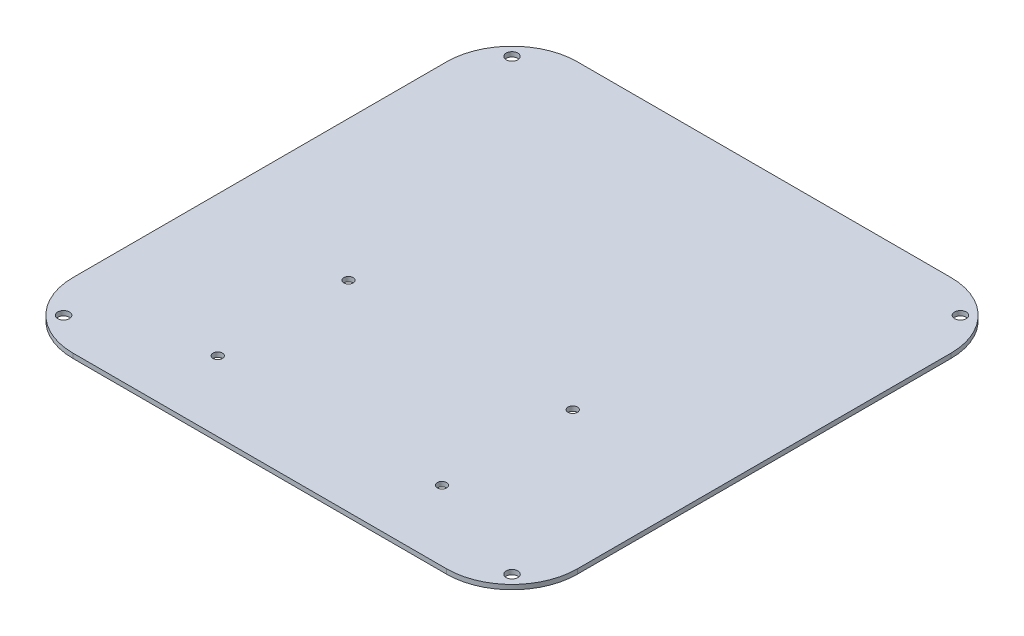
ISO-10303-21;
HEADER;
FILE_DESCRIPTION(('STEP AP214'),'2;1');
FILE_NAME('part.step','',(''),(''),'','','');
FILE_SCHEMA(('AUTOMOTIVE_DESIGN { 1 0 10303 214 1 1 1 1 }'));
ENDSEC;
DATA;
#1=APPLICATION_CONTEXT('core data for automotive mechanical design processes');
#2=APPLICATION_PROTOCOL_DEFINITION('international standard','automotive_design',2000,#1);
#3=PRODUCT_CONTEXT('',#1,'mechanical');
#4=PRODUCT('Part','Part','',(#3));
#5=PRODUCT_RELATED_PRODUCT_CATEGORY('part','',(#4));
#6=PRODUCT_DEFINITION_FORMATION('','',#4);
#7=PRODUCT_DEFINITION_CONTEXT('part definition',#1,'design');
#8=PRODUCT_DEFINITION('design','',#6,#7);
#9=PRODUCT_DEFINITION_SHAPE('','',#8);
#10=(LENGTH_UNIT() NAMED_UNIT(*) SI_UNIT(.MILLI.,.METRE.));
#11=(NAMED_UNIT(*) PLANE_ANGLE_UNIT() SI_UNIT($,.RADIAN.));
#12=(NAMED_UNIT(*) SI_UNIT($,.STERADIAN.) SOLID_ANGLE_UNIT());
#13=UNCERTAINTY_MEASURE_WITH_UNIT(LENGTH_MEASURE(1.E-05),#10,'distance_accuracy_value','');
#14=(GEOMETRIC_REPRESENTATION_CONTEXT(3) GLOBAL_UNCERTAINTY_ASSIGNED_CONTEXT((#13)) GLOBAL_UNIT_ASSIGNED_CONTEXT((#10,
#11,#12)) REPRESENTATION_CONTEXT('',''));
#15=CARTESIAN_POINT('',(0.,0.,0.));
#16=DIRECTION('',(0.,0.,1.));
#17=DIRECTION('',(1.,0.,0.));
#18=AXIS2_PLACEMENT_3D('',#15,#16,#17);
#19=CARTESIAN_POINT('',(-80.,2.,-80.));
#20=DIRECTION('',(0.,-1.,0.));
#21=DIRECTION('',(0.,0.,-1.));
#22=AXIS2_PLACEMENT_3D('',#19,#20,#21);
#23=CYLINDRICAL_SURFACE('',#22,28.);
#24=CARTESIAN_POINT('',(-80.,0.,-80.));
#25=DIRECTION('',(0.,1.,0.));
#26=DIRECTION('',(0.,0.,1.));
#27=AXIS2_PLACEMENT_3D('',#24,#25,#26);
#28=CIRCLE('',#27,28.);
#29=CARTESIAN_POINT('',(-108.,0.,-79.9999999999998));
#30=VERTEX_POINT('',#29);
#31=CARTESIAN_POINT('',(-79.9999999999998,0.,-108.));
#32=VERTEX_POINT('',#31);
#33=EDGE_CURVE('E153',#30,#32,#28,.F.);
#34=ORIENTED_EDGE('',*,*,#33,.F.);
#35=DIRECTION('',(0.,-1.,0.));
#36=VECTOR('',#35,1.);
#37=CARTESIAN_POINT('',(-108.,2.,-79.9999999999998));
#38=LINE('',#37,#36);
#39=CARTESIAN_POINT('',(-108.,2.,-79.9999999999998));
#40=VERTEX_POINT('',#39);
#41=EDGE_CURVE('E11',#40,#30,#38,.T.);
#42=ORIENTED_EDGE('',*,*,#41,.F.);
#43=CARTESIAN_POINT('',(-80.,2.,-80.));
#44=DIRECTION('',(0.,1.,0.));
#45=DIRECTION('',(0.,0.,1.));
#46=AXIS2_PLACEMENT_3D('',#43,#44,#45);
#47=CIRCLE('',#46,28.);
#48=CARTESIAN_POINT('',(-79.9999999999998,2.,-108.));
#49=VERTEX_POINT('',#48);
#50=EDGE_CURVE('E267',#40,#49,#47,.F.);
#51=ORIENTED_EDGE('',*,*,#50,.T.);
#52=DIRECTION('',(0.,-1.,0.));
#53=VECTOR('',#52,1.);
#54=CARTESIAN_POINT('',(-79.9999999999998,2.,-108.));
#55=LINE('',#54,#53);
#56=EDGE_CURVE('E50',#49,#32,#55,.T.);
#57=ORIENTED_EDGE('',*,*,#56,.T.);
#58=EDGE_LOOP('',(#34,#42,#51,#57));
#59=FACE_BOUND('',#58,.T.);
#60=ADVANCED_FACE('F33',(#59),#23,.T.);
#61=CARTESIAN_POINT('',(-108.,2.,0.));
#62=DIRECTION('',(-1.,0.,0.));
#63=DIRECTION('',(0.,0.,1.));
#64=AXIS2_PLACEMENT_3D('',#61,#62,#63);
#65=PLANE('',#64);
#66=DIRECTION('',(0.,0.,-1.));
#67=VECTOR('',#66,1.);
#68=CARTESIAN_POINT('',(-108.,0.,0.));
#69=LINE('',#68,#67);
#70=CARTESIAN_POINT('',(-108.,0.,79.9999999999998));
#71=VERTEX_POINT('',#70);
#72=EDGE_CURVE('E148',#71,#30,#69,.T.);
#73=ORIENTED_EDGE('',*,*,#72,.F.);
#74=DIRECTION('',(0.,-1.,0.));
#75=VECTOR('',#74,1.);
#76=CARTESIAN_POINT('',(-108.,2.,79.9999999999998));
#77=LINE('',#76,#75);
#78=CARTESIAN_POINT('',(-108.,2.,79.9999999999998));
#79=VERTEX_POINT('',#78);
#80=EDGE_CURVE('E42',#79,#71,#77,.T.);
#81=ORIENTED_EDGE('',*,*,#80,.F.);
#82=DIRECTION('',(0.,0.,-1.));
#83=VECTOR('',#82,1.);
#84=CARTESIAN_POINT('',(-108.,2.,0.));
#85=LINE('',#84,#83);
#86=EDGE_CURVE('E269',#79,#40,#85,.T.);
#87=ORIENTED_EDGE('',*,*,#86,.T.);
#88=ORIENTED_EDGE('',*,*,#41,.T.);
#89=EDGE_LOOP('',(#73,#81,#87,#88));
#90=FACE_BOUND('',#89,.T.);
#91=ADVANCED_FACE('F152',(#90),#65,.T.);
#92=CARTESIAN_POINT('',(-80.,2.,80.));
#93=DIRECTION('',(0.,-1.,0.));
#94=DIRECTION('',(0.,0.,-1.));
#95=AXIS2_PLACEMENT_3D('',#92,#93,#94);
#96=CYLINDRICAL_SURFACE('',#95,28.);
#97=CARTESIAN_POINT('',(-80.,0.,80.));
#98=DIRECTION('',(0.,1.,0.));
#99=DIRECTION('',(0.,0.,1.));
#100=AXIS2_PLACEMENT_3D('',#97,#98,#99);
#101=CIRCLE('',#100,28.);
#102=CARTESIAN_POINT('',(-79.9999999999998,0.,108.));
#103=VERTEX_POINT('',#102);
#104=EDGE_CURVE('E138',#71,#103,#101,.T.);
#105=ORIENTED_EDGE('',*,*,#104,.T.);
#106=DIRECTION('',(0.,-1.,0.));
#107=VECTOR('',#106,1.);
#108=CARTESIAN_POINT('',(-79.9999999999998,2.,108.));
#109=LINE('',#108,#107);
#110=CARTESIAN_POINT('',(-79.9999999999998,2.,108.));
#111=VERTEX_POINT('',#110);
#112=EDGE_CURVE('E130',#111,#103,#109,.T.);
#113=ORIENTED_EDGE('',*,*,#112,.F.);
#114=CARTESIAN_POINT('',(-80.,2.,80.));
#115=DIRECTION('',(0.,1.,0.));
#116=DIRECTION('',(0.,0.,1.));
#117=AXIS2_PLACEMENT_3D('',#114,#115,#116);
#118=CIRCLE('',#117,28.);
#119=EDGE_CURVE('E140',#79,#111,#118,.T.);
#120=ORIENTED_EDGE('',*,*,#119,.F.);
#121=ORIENTED_EDGE('',*,*,#80,.T.);
#122=EDGE_LOOP('',(#105,#113,#120,#121));
#123=FACE_BOUND('',#122,.T.);
#124=ADVANCED_FACE('F136',(#123),#96,.T.);
#125=CARTESIAN_POINT('',(0.,2.,108.));
#126=DIRECTION('',(0.,0.,-1.));
#127=DIRECTION('',(-1.,0.,0.));
#128=AXIS2_PLACEMENT_3D('',#125,#126,#127);
#129=PLANE('',#128);
#130=DIRECTION('',(1.,0.,0.));
#131=VECTOR('',#130,1.);
#132=CARTESIAN_POINT('',(0.,0.,108.));
#133=LINE('',#132,#131);
#134=CARTESIAN_POINT('',(79.9999999999998,0.,108.));
#135=VERTEX_POINT('',#134);
#136=EDGE_CURVE('E150',#103,#135,#133,.T.);
#137=ORIENTED_EDGE('',*,*,#136,.T.);
#138=DIRECTION('',(0.,-1.,0.));
#139=VECTOR('',#138,1.);
#140=CARTESIAN_POINT('',(79.9999999999998,2.,108.));
#141=LINE('',#140,#139);
#142=CARTESIAN_POINT('',(79.9999999999998,2.,108.));
#143=VERTEX_POINT('',#142);
#144=EDGE_CURVE('E123',#143,#135,#141,.T.);
#145=ORIENTED_EDGE('',*,*,#144,.F.);
#146=DIRECTION('',(1.,0.,0.));
#147=VECTOR('',#146,1.);
#148=CARTESIAN_POINT('',(0.,2.,108.));
#149=LINE('',#148,#147);
#150=EDGE_CURVE('E276',#111,#143,#149,.T.);
#151=ORIENTED_EDGE('',*,*,#150,.F.);
#152=ORIENTED_EDGE('',*,*,#112,.T.);
#153=EDGE_LOOP('',(#137,#145,#151,#152));
#154=FACE_BOUND('',#153,.T.);
#155=ADVANCED_FACE('F218',(#154),#129,.F.);
#156=CARTESIAN_POINT('',(80.,2.,80.));
#157=DIRECTION('',(0.,-1.,0.));
#158=DIRECTION('',(0.,0.,-1.));
#159=AXIS2_PLACEMENT_3D('',#156,#157,#158);
#160=CYLINDRICAL_SURFACE('',#159,28.);
#161=CARTESIAN_POINT('',(80.,0.,80.));
#162=DIRECTION('',(0.,1.,0.));
#163=DIRECTION('',(0.,0.,1.));
#164=AXIS2_PLACEMENT_3D('',#161,#162,#163);
#165=CIRCLE('',#164,28.);
#166=CARTESIAN_POINT('',(108.,0.,79.9999999999998));
#167=VERTEX_POINT('',#166);
#168=EDGE_CURVE('E160',#135,#167,#165,.T.);
#169=ORIENTED_EDGE('',*,*,#168,.T.);
#170=DIRECTION('',(0.,-1.,0.));
#171=VECTOR('',#170,1.);
#172=CARTESIAN_POINT('',(108.,2.,79.9999999999998));
#173=LINE('',#172,#171);
#174=CARTESIAN_POINT('',(108.,2.,79.9999999999998));
#175=VERTEX_POINT('',#174);
#176=EDGE_CURVE('E121',#175,#167,#173,.T.);
#177=ORIENTED_EDGE('',*,*,#176,.F.);
#178=CARTESIAN_POINT('',(80.,2.,80.));
#179=DIRECTION('',(0.,1.,0.));
#180=DIRECTION('',(0.,0.,1.));
#181=AXIS2_PLACEMENT_3D('',#178,#179,#180);
#182=CIRCLE('',#181,28.);
#183=EDGE_CURVE('E114',#143,#175,#182,.T.);
#184=ORIENTED_EDGE('',*,*,#183,.F.);
#185=ORIENTED_EDGE('',*,*,#144,.T.);
#186=EDGE_LOOP('',(#169,#177,#184,#185));
#187=FACE_BOUND('',#186,.T.);
#188=ADVANCED_FACE('F221',(#187),#160,.T.);
#189=CARTESIAN_POINT('',(108.,2.,0.));
#190=DIRECTION('',(-1.,0.,0.));
#191=DIRECTION('',(0.,0.,1.));
#192=AXIS2_PLACEMENT_3D('',#189,#190,#191);
#193=PLANE('',#192);
#194=DIRECTION('',(0.,0.,-1.));
#195=VECTOR('',#194,1.);
#196=CARTESIAN_POINT('',(108.,0.,0.));
#197=LINE('',#196,#195);
#198=CARTESIAN_POINT('',(108.,0.,-79.9999999999998));
#199=VERTEX_POINT('',#198);
#200=EDGE_CURVE('E120',#167,#199,#197,.T.);
#201=ORIENTED_EDGE('',*,*,#200,.T.);
#202=DIRECTION('',(0.,-1.,0.));
#203=VECTOR('',#202,1.);
#204=CARTESIAN_POINT('',(108.,2.,-79.9999999999998));
#205=LINE('',#204,#203);
#206=CARTESIAN_POINT('',(108.,2.,-79.9999999999998));
#207=VERTEX_POINT('',#206);
#208=EDGE_CURVE('E104',#207,#199,#205,.T.);
#209=ORIENTED_EDGE('',*,*,#208,.F.);
#210=DIRECTION('',(0.,0.,-1.));
#211=VECTOR('',#210,1.);
#212=CARTESIAN_POINT('',(108.,2.,0.));
#213=LINE('',#212,#211);
#214=EDGE_CURVE('E109',#175,#207,#213,.T.);
#215=ORIENTED_EDGE('',*,*,#214,.F.);
#216=ORIENTED_EDGE('',*,*,#176,.T.);
#217=EDGE_LOOP('',(#201,#209,#215,#216));
#218=FACE_BOUND('',#217,.T.);
#219=ADVANCED_FACE('F119',(#218),#193,.F.);
#220=CARTESIAN_POINT('',(80.,2.,-80.));
#221=DIRECTION('',(0.,-1.,0.));
#222=DIRECTION('',(0.,0.,-1.));
#223=AXIS2_PLACEMENT_3D('',#220,#221,#222);
#224=CYLINDRICAL_SURFACE('',#223,28.);
#225=CARTESIAN_POINT('',(80.,0.,-80.));
#226=DIRECTION('',(0.,1.,0.));
#227=DIRECTION('',(0.,0.,1.));
#228=AXIS2_PLACEMENT_3D('',#225,#226,#227);
#229=CIRCLE('',#228,28.);
#230=CARTESIAN_POINT('',(79.9999999999998,0.,-108.));
#231=VERTEX_POINT('',#230);
#232=EDGE_CURVE('E164',#199,#231,#229,.T.);
#233=ORIENTED_EDGE('',*,*,#232,.T.);
#234=DIRECTION('',(0.,-1.,0.));
#235=VECTOR('',#234,1.);
#236=CARTESIAN_POINT('',(79.9999999999998,2.,-108.));
#237=LINE('',#236,#235);
#238=CARTESIAN_POINT('',(79.9999999999998,2.,-108.));
#239=VERTEX_POINT('',#238);
#240=EDGE_CURVE('E76',#239,#231,#237,.T.);
#241=ORIENTED_EDGE('',*,*,#240,.F.);
#242=CARTESIAN_POINT('',(80.,2.,-80.));
#243=DIRECTION('',(0.,1.,0.));
#244=DIRECTION('',(0.,0.,1.));
#245=AXIS2_PLACEMENT_3D('',#242,#243,#244);
#246=CIRCLE('',#245,28.);
#247=EDGE_CURVE('E100',#207,#239,#246,.T.);
#248=ORIENTED_EDGE('',*,*,#247,.F.);
#249=ORIENTED_EDGE('',*,*,#208,.T.);
#250=EDGE_LOOP('',(#233,#241,#248,#249));
#251=FACE_BOUND('',#250,.T.);
#252=ADVANCED_FACE('F102',(#251),#224,.T.);
#253=CARTESIAN_POINT('',(-48.,2.,78.));
#254=DIRECTION('',(0.,-1.,0.));
#255=DIRECTION('',(0.,0.,-1.));
#256=AXIS2_PLACEMENT_3D('',#253,#254,#255);
#257=CYLINDRICAL_SURFACE('',#256,2.);
#258=CARTESIAN_POINT('',(-48.,2.,78.));
#259=DIRECTION('',(0.,1.,0.));
#260=DIRECTION('',(0.,0.,1.));
#261=AXIS2_PLACEMENT_3D('',#258,#259,#260);
#262=CIRCLE('',#261,2.);
#263=CARTESIAN_POINT('',(-48.,2.,80.));
#264=VERTEX_POINT('',#263);
#265=EDGE_CURVE('E266',#264,#264,#262,.T.);
#266=ORIENTED_EDGE('',*,*,#265,.T.);
#267=EDGE_LOOP('',(#266));
#268=FACE_BOUND('',#267,.T.);
#269=CARTESIAN_POINT('',(-48.,0.,78.));
#270=DIRECTION('',(0.,1.,0.));
#271=DIRECTION('',(0.,0.,1.));
#272=AXIS2_PLACEMENT_3D('',#269,#270,#271);
#273=CIRCLE('',#272,2.);
#274=CARTESIAN_POINT('',(-48.,0.,80.));
#275=VERTEX_POINT('',#274);
#276=EDGE_CURVE('E155',#275,#275,#273,.T.);
#277=ORIENTED_EDGE('',*,*,#276,.F.);
#278=EDGE_LOOP('',(#277));
#279=FACE_BOUND('',#278,.T.);
#280=ADVANCED_FACE('F195',(#268,#279),#257,.F.);
#281=CARTESIAN_POINT('',(-96.,2.,-96.));
#282=DIRECTION('',(0.,-1.,0.));
#283=DIRECTION('',(0.,0.,-1.));
#284=AXIS2_PLACEMENT_3D('',#281,#282,#283);
#285=CYLINDRICAL_SURFACE('',#284,2.50000000000001);
#286=CARTESIAN_POINT('',(-96.,2.,-96.));
#287=DIRECTION('',(0.,1.,0.));
#288=DIRECTION('',(0.,0.,1.));
#289=AXIS2_PLACEMENT_3D('',#286,#287,#288);
#290=CIRCLE('',#289,2.50000000000001);
#291=CARTESIAN_POINT('',(-96.,2.,-93.5));
#292=VERTEX_POINT('',#291);
#293=EDGE_CURVE('E264',#292,#292,#290,.T.);
#294=ORIENTED_EDGE('',*,*,#293,.T.);
#295=EDGE_LOOP('',(#294));
#296=FACE_BOUND('',#295,.T.);
#297=CARTESIAN_POINT('',(-96.,0.,-96.));
#298=DIRECTION('',(0.,1.,0.));
#299=DIRECTION('',(0.,0.,1.));
#300=AXIS2_PLACEMENT_3D('',#297,#298,#299);
#301=CIRCLE('',#300,2.50000000000001);
#302=CARTESIAN_POINT('',(-96.,0.,-93.5));
#303=VERTEX_POINT('',#302);
#304=EDGE_CURVE('E189',#303,#303,#301,.T.);
#305=ORIENTED_EDGE('',*,*,#304,.F.);
#306=EDGE_LOOP('',(#305));
#307=FACE_BOUND('',#306,.T.);
#308=ADVANCED_FACE('F197',(#296,#307),#285,.F.);
#309=CARTESIAN_POINT('',(96.,2.,-96.));
#310=DIRECTION('',(0.,-1.,0.));
#311=DIRECTION('',(0.,0.,-1.));
#312=AXIS2_PLACEMENT_3D('',#309,#310,#311);
#313=CYLINDRICAL_SURFACE('',#312,2.50000000000001);
#314=CARTESIAN_POINT('',(96.,2.,-96.));
#315=DIRECTION('',(0.,1.,0.));
#316=DIRECTION('',(0.,0.,1.));
#317=AXIS2_PLACEMENT_3D('',#314,#315,#316);
#318=CIRCLE('',#317,2.50000000000001);
#319=CARTESIAN_POINT('',(96.,2.,-93.5));
#320=VERTEX_POINT('',#319);
#321=EDGE_CURVE('E260',#320,#320,#318,.T.);
#322=ORIENTED_EDGE('',*,*,#321,.T.);
#323=EDGE_LOOP('',(#322));
#324=FACE_BOUND('',#323,.T.);
#325=CARTESIAN_POINT('',(96.,0.,-96.));
#326=DIRECTION('',(0.,1.,0.));
#327=DIRECTION('',(0.,0.,1.));
#328=AXIS2_PLACEMENT_3D('',#325,#326,#327);
#329=CIRCLE('',#328,2.50000000000001);
#330=CARTESIAN_POINT('',(96.,0.,-93.5));
#331=VERTEX_POINT('',#330);
#332=EDGE_CURVE('E186',#331,#331,#329,.T.);
#333=ORIENTED_EDGE('',*,*,#332,.F.);
#334=EDGE_LOOP('',(#333));
#335=FACE_BOUND('',#334,.T.);
#336=ADVANCED_FACE('F204',(#324,#335),#313,.F.);
#337=CARTESIAN_POINT('',(96.,2.,96.));
#338=DIRECTION('',(0.,-1.,0.));
#339=DIRECTION('',(0.,0.,-1.));
#340=AXIS2_PLACEMENT_3D('',#337,#338,#339);
#341=CYLINDRICAL_SURFACE('',#340,2.50000000000001);
#342=CARTESIAN_POINT('',(96.,2.,96.));
#343=DIRECTION('',(0.,1.,0.));
#344=DIRECTION('',(0.,0.,1.));
#345=AXIS2_PLACEMENT_3D('',#342,#343,#344);
#346=CIRCLE('',#345,2.50000000000001);
#347=CARTESIAN_POINT('',(96.,2.,98.5));
#348=VERTEX_POINT('',#347);
#349=EDGE_CURVE('E256',#348,#348,#346,.T.);
#350=ORIENTED_EDGE('',*,*,#349,.T.);
#351=EDGE_LOOP('',(#350));
#352=FACE_BOUND('',#351,.T.);
#353=CARTESIAN_POINT('',(96.,0.,96.));
#354=DIRECTION('',(0.,1.,0.));
#355=DIRECTION('',(0.,0.,1.));
#356=AXIS2_PLACEMENT_3D('',#353,#354,#355);
#357=CIRCLE('',#356,2.50000000000001);
#358=CARTESIAN_POINT('',(96.,0.,98.5));
#359=VERTEX_POINT('',#358);
#360=EDGE_CURVE('E183',#359,#359,#357,.T.);
#361=ORIENTED_EDGE('',*,*,#360,.F.);
#362=EDGE_LOOP('',(#361));
#363=FACE_BOUND('',#362,.T.);
#364=ADVANCED_FACE('F304',(#352,#363),#341,.F.);
#365=CARTESIAN_POINT('',(-96.,2.,96.));
#366=DIRECTION('',(0.,-1.,0.));
#367=DIRECTION('',(0.,0.,-1.));
#368=AXIS2_PLACEMENT_3D('',#365,#366,#367);
#369=CYLINDRICAL_SURFACE('',#368,2.50000000000001);
#370=CARTESIAN_POINT('',(-96.,2.,96.));
#371=DIRECTION('',(0.,1.,0.));
#372=DIRECTION('',(0.,0.,1.));
#373=AXIS2_PLACEMENT_3D('',#370,#371,#372);
#374=CIRCLE('',#373,2.50000000000001);
#375=CARTESIAN_POINT('',(-96.,2.,98.5));
#376=VERTEX_POINT('',#375);
#377=EDGE_CURVE('E252',#376,#376,#374,.T.);
#378=ORIENTED_EDGE('',*,*,#377,.T.);
#379=EDGE_LOOP('',(#378));
#380=FACE_BOUND('',#379,.T.);
#381=CARTESIAN_POINT('',(-96.,0.,96.));
#382=DIRECTION('',(0.,1.,0.));
#383=DIRECTION('',(0.,0.,1.));
#384=AXIS2_PLACEMENT_3D('',#381,#382,#383);
#385=CIRCLE('',#384,2.50000000000001);
#386=CARTESIAN_POINT('',(-96.,0.,98.5));
#387=VERTEX_POINT('',#386);
#388=EDGE_CURVE('E180',#387,#387,#385,.T.);
#389=ORIENTED_EDGE('',*,*,#388,.F.);
#390=EDGE_LOOP('',(#389));
#391=FACE_BOUND('',#390,.T.);
#392=ADVANCED_FACE('F310',(#380,#391),#369,.F.);
#393=CARTESIAN_POINT('',(-48.,2.,22.));
#394=DIRECTION('',(0.,-1.,0.));
#395=DIRECTION('',(0.,0.,-1.));
#396=AXIS2_PLACEMENT_3D('',#393,#394,#395);
#397=CYLINDRICAL_SURFACE('',#396,2.);
#398=CARTESIAN_POINT('',(-48.,2.,22.));
#399=DIRECTION('',(0.,1.,0.));
#400=DIRECTION('',(0.,0.,1.));
#401=AXIS2_PLACEMENT_3D('',#398,#399,#400);
#402=CIRCLE('',#401,2.);
#403=CARTESIAN_POINT('',(-48.,2.,24.));
#404=VERTEX_POINT('',#403);
#405=EDGE_CURVE('E248',#404,#404,#402,.T.);
#406=ORIENTED_EDGE('',*,*,#405,.T.);
#407=EDGE_LOOP('',(#406));
#408=FACE_BOUND('',#407,.T.);
#409=CARTESIAN_POINT('',(-48.,0.,22.));
#410=DIRECTION('',(0.,1.,0.));
#411=DIRECTION('',(0.,0.,1.));
#412=AXIS2_PLACEMENT_3D('',#409,#410,#411);
#413=CIRCLE('',#412,2.);
#414=CARTESIAN_POINT('',(-48.,0.,24.));
#415=VERTEX_POINT('',#414);
#416=EDGE_CURVE('E177',#415,#415,#413,.T.);
#417=ORIENTED_EDGE('',*,*,#416,.F.);
#418=EDGE_LOOP('',(#417));
#419=FACE_BOUND('',#418,.T.);
#420=ADVANCED_FACE('F316',(#408,#419),#397,.F.);
#421=CARTESIAN_POINT('',(48.,2.,78.));
#422=DIRECTION('',(0.,-1.,0.));
#423=DIRECTION('',(0.,0.,-1.));
#424=AXIS2_PLACEMENT_3D('',#421,#422,#423);
#425=CYLINDRICAL_SURFACE('',#424,2.);
#426=CARTESIAN_POINT('',(48.,2.,78.));
#427=DIRECTION('',(0.,1.,0.));
#428=DIRECTION('',(0.,0.,1.));
#429=AXIS2_PLACEMENT_3D('',#426,#427,#428);
#430=CIRCLE('',#429,2.);
#431=CARTESIAN_POINT('',(48.,2.,80.));
#432=VERTEX_POINT('',#431);
#433=EDGE_CURVE('E244',#432,#432,#430,.T.);
#434=ORIENTED_EDGE('',*,*,#433,.T.);
#435=EDGE_LOOP('',(#434));
#436=FACE_BOUND('',#435,.T.);
#437=CARTESIAN_POINT('',(48.,0.,78.));
#438=DIRECTION('',(0.,1.,0.));
#439=DIRECTION('',(0.,0.,1.));
#440=AXIS2_PLACEMENT_3D('',#437,#438,#439);
#441=CIRCLE('',#440,2.);
#442=CARTESIAN_POINT('',(48.,0.,80.));
#443=VERTEX_POINT('',#442);
#444=EDGE_CURVE('E174',#443,#443,#441,.T.);
#445=ORIENTED_EDGE('',*,*,#444,.F.);
#446=EDGE_LOOP('',(#445));
#447=FACE_BOUND('',#446,.T.);
#448=ADVANCED_FACE('F287',(#436,#447),#425,.F.);
#449=CARTESIAN_POINT('',(48.,2.,22.));
#450=DIRECTION('',(0.,-1.,0.));
#451=DIRECTION('',(0.,0.,-1.));
#452=AXIS2_PLACEMENT_3D('',#449,#450,#451);
#453=CYLINDRICAL_SURFACE('',#452,2.);
#454=CARTESIAN_POINT('',(48.,2.,22.));
#455=DIRECTION('',(0.,1.,0.));
#456=DIRECTION('',(0.,0.,1.));
#457=AXIS2_PLACEMENT_3D('',#454,#455,#456);
#458=CIRCLE('',#457,2.);
#459=CARTESIAN_POINT('',(48.,2.,24.));
#460=VERTEX_POINT('',#459);
#461=EDGE_CURVE('E168',#460,#460,#458,.T.);
#462=ORIENTED_EDGE('',*,*,#461,.T.);
#463=EDGE_LOOP('',(#462));
#464=FACE_BOUND('',#463,.T.);
#465=CARTESIAN_POINT('',(48.,0.,22.));
#466=DIRECTION('',(0.,1.,0.));
#467=DIRECTION('',(0.,0.,1.));
#468=AXIS2_PLACEMENT_3D('',#465,#466,#467);
#469=CIRCLE('',#468,2.);
#470=CARTESIAN_POINT('',(48.,0.,24.));
#471=VERTEX_POINT('',#470);
#472=EDGE_CURVE('E171',#471,#471,#469,.T.);
#473=ORIENTED_EDGE('',*,*,#472,.F.);
#474=EDGE_LOOP('',(#473));
#475=FACE_BOUND('',#474,.T.);
#476=ADVANCED_FACE('F35',(#464,#475),#453,.F.);
#477=CARTESIAN_POINT('',(0.,2.,-108.));
#478=DIRECTION('',(0.,0.,-1.));
#479=DIRECTION('',(-1.,0.,0.));
#480=AXIS2_PLACEMENT_3D('',#477,#478,#479);
#481=PLANE('',#480);
#482=DIRECTION('',(1.,0.,0.));
#483=VECTOR('',#482,1.);
#484=CARTESIAN_POINT('',(0.,0.,-108.));
#485=LINE('',#484,#483);
#486=EDGE_CURVE('E166',#32,#231,#485,.T.);
#487=ORIENTED_EDGE('',*,*,#486,.F.);
#488=ORIENTED_EDGE('',*,*,#56,.F.);
#489=DIRECTION('',(1.,0.,0.));
#490=VECTOR('',#489,1.);
#491=CARTESIAN_POINT('',(0.,2.,-108.));
#492=LINE('',#491,#490);
#493=EDGE_CURVE('E108',#49,#239,#492,.T.);
#494=ORIENTED_EDGE('',*,*,#493,.T.);
#495=ORIENTED_EDGE('',*,*,#240,.T.);
#496=EDGE_LOOP('',(#487,#488,#494,#495));
#497=FACE_BOUND('',#496,.T.);
#498=ADVANCED_FACE('F228',(#497),#481,.T.);
#499=CARTESIAN_POINT('',(0.,2.,0.));
#500=DIRECTION('',(0.,1.,0.));
#501=DIRECTION('',(0.,0.,1.));
#502=AXIS2_PLACEMENT_3D('',#499,#500,#501);
#503=PLANE('',#502);
#504=ORIENTED_EDGE('',*,*,#461,.F.);
#505=EDGE_LOOP('',(#504));
#506=FACE_BOUND('',#505,.T.);
#507=ORIENTED_EDGE('',*,*,#433,.F.);
#508=EDGE_LOOP('',(#507));
#509=FACE_BOUND('',#508,.T.);
#510=ORIENTED_EDGE('',*,*,#405,.F.);
#511=EDGE_LOOP('',(#510));
#512=FACE_BOUND('',#511,.T.);
#513=ORIENTED_EDGE('',*,*,#377,.F.);
#514=EDGE_LOOP('',(#513));
#515=FACE_BOUND('',#514,.T.);
#516=ORIENTED_EDGE('',*,*,#349,.F.);
#517=EDGE_LOOP('',(#516));
#518=FACE_BOUND('',#517,.T.);
#519=ORIENTED_EDGE('',*,*,#321,.F.);
#520=EDGE_LOOP('',(#519));
#521=FACE_BOUND('',#520,.T.);
#522=ORIENTED_EDGE('',*,*,#293,.F.);
#523=EDGE_LOOP('',(#522));
#524=FACE_BOUND('',#523,.T.);
#525=ORIENTED_EDGE('',*,*,#265,.F.);
#526=EDGE_LOOP('',(#525));
#527=FACE_BOUND('',#526,.T.);
#528=ORIENTED_EDGE('',*,*,#50,.F.);
#529=ORIENTED_EDGE('',*,*,#86,.F.);
#530=ORIENTED_EDGE('',*,*,#119,.T.);
#531=ORIENTED_EDGE('',*,*,#150,.T.);
#532=ORIENTED_EDGE('',*,*,#183,.T.);
#533=ORIENTED_EDGE('',*,*,#214,.T.);
#534=ORIENTED_EDGE('',*,*,#247,.T.);
#535=ORIENTED_EDGE('',*,*,#493,.F.);
#536=EDGE_LOOP('',(#528,#529,#530,#531,#532,#533,#534,#535));
#537=FACE_BOUND('',#536,.T.);
#538=ADVANCED_FACE('F112',(#506,#509,#512,#515,#518,#521,#524,#527,#537),#503,.T.);
#539=CARTESIAN_POINT('',(0.,0.,0.));
#540=DIRECTION('',(0.,1.,0.));
#541=DIRECTION('',(0.,0.,1.));
#542=AXIS2_PLACEMENT_3D('',#539,#540,#541);
#543=PLANE('',#542);
#544=ORIENTED_EDGE('',*,*,#472,.T.);
#545=EDGE_LOOP('',(#544));
#546=FACE_BOUND('',#545,.T.);
#547=ORIENTED_EDGE('',*,*,#444,.T.);
#548=EDGE_LOOP('',(#547));
#549=FACE_BOUND('',#548,.T.);
#550=ORIENTED_EDGE('',*,*,#416,.T.);
#551=EDGE_LOOP('',(#550));
#552=FACE_BOUND('',#551,.T.);
#553=ORIENTED_EDGE('',*,*,#388,.T.);
#554=EDGE_LOOP('',(#553));
#555=FACE_BOUND('',#554,.T.);
#556=ORIENTED_EDGE('',*,*,#360,.T.);
#557=EDGE_LOOP('',(#556));
#558=FACE_BOUND('',#557,.T.);
#559=ORIENTED_EDGE('',*,*,#332,.T.);
#560=EDGE_LOOP('',(#559));
#561=FACE_BOUND('',#560,.T.);
#562=ORIENTED_EDGE('',*,*,#304,.T.);
#563=EDGE_LOOP('',(#562));
#564=FACE_BOUND('',#563,.T.);
#565=ORIENTED_EDGE('',*,*,#276,.T.);
#566=EDGE_LOOP('',(#565));
#567=FACE_BOUND('',#566,.T.);
#568=ORIENTED_EDGE('',*,*,#33,.T.);
#569=ORIENTED_EDGE('',*,*,#486,.T.);
#570=ORIENTED_EDGE('',*,*,#232,.F.);
#571=ORIENTED_EDGE('',*,*,#200,.F.);
#572=ORIENTED_EDGE('',*,*,#168,.F.);
#573=ORIENTED_EDGE('',*,*,#136,.F.);
#574=ORIENTED_EDGE('',*,*,#104,.F.);
#575=ORIENTED_EDGE('',*,*,#72,.T.);
#576=EDGE_LOOP('',(#568,#569,#570,#571,#572,#573,#574,#575));
#577=FACE_BOUND('',#576,.T.);
#578=ADVANCED_FACE('F147',(#546,#549,#552,#555,#558,#561,#564,#567,#577),#543,.F.);
#579=CLOSED_SHELL('',(#60,#91,#124,#155,#188,#219,#252,#280,#308,#336,#364,#392,#420,#448,#476,
#498,#538,#578));
#580=MANIFOLD_SOLID_BREP('B2',#579);
#581=ADVANCED_BREP_SHAPE_REPRESENTATION('',(#18,#580),#14);
#582=SHAPE_DEFINITION_REPRESENTATION(#9,#581);
ENDSEC;
END-ISO-10303-21;
